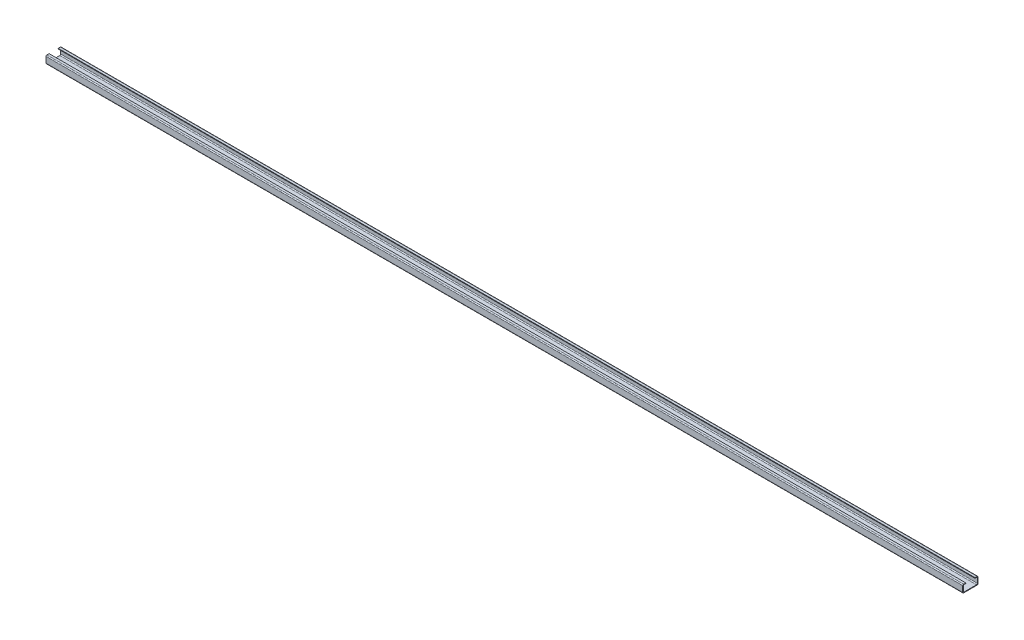
ISO-10303-21;
HEADER;
FILE_DESCRIPTION(('STEP AP214'),'2;1');
FILE_NAME('part.step','',(''),(''),'','','');
FILE_SCHEMA(('AUTOMOTIVE_DESIGN { 1 0 10303 214 1 1 1 1 }'));
ENDSEC;
DATA;
#1=APPLICATION_CONTEXT('core data for automotive mechanical design processes');
#2=APPLICATION_PROTOCOL_DEFINITION('international standard','automotive_design',2000,#1);
#3=PRODUCT_CONTEXT('',#1,'mechanical');
#4=PRODUCT('Part','Part','',(#3));
#5=PRODUCT_RELATED_PRODUCT_CATEGORY('part','',(#4));
#6=PRODUCT_DEFINITION_FORMATION('','',#4);
#7=PRODUCT_DEFINITION_CONTEXT('part definition',#1,'design');
#8=PRODUCT_DEFINITION('design','',#6,#7);
#9=PRODUCT_DEFINITION_SHAPE('','',#8);
#10=(LENGTH_UNIT() NAMED_UNIT(*) SI_UNIT(.MILLI.,.METRE.));
#11=(NAMED_UNIT(*) PLANE_ANGLE_UNIT() SI_UNIT($,.RADIAN.));
#12=(NAMED_UNIT(*) SI_UNIT($,.STERADIAN.) SOLID_ANGLE_UNIT());
#13=UNCERTAINTY_MEASURE_WITH_UNIT(LENGTH_MEASURE(1.E-05),#10,'distance_accuracy_value','');
#14=(GEOMETRIC_REPRESENTATION_CONTEXT(3) GLOBAL_UNCERTAINTY_ASSIGNED_CONTEXT((#13)) GLOBAL_UNIT_ASSIGNED_CONTEXT((#10,
#11,#12)) REPRESENTATION_CONTEXT('',''));
#15=CARTESIAN_POINT('',(0.,0.,0.));
#16=DIRECTION('',(0.,0.,1.));
#17=DIRECTION('',(1.,0.,0.));
#18=AXIS2_PLACEMENT_3D('',#15,#16,#17);
#19=CARTESIAN_POINT('',(6000.,25.,-50.));
#20=DIRECTION('',(0.,0.,1.));
#21=DIRECTION('',(0.,-1.,0.));
#22=AXIS2_PLACEMENT_3D('',#19,#20,#21);
#23=PLANE('',#22);
#24=DIRECTION('',(0.,1.,0.));
#25=VECTOR('',#24,1.);
#26=CARTESIAN_POINT('',(0.,25.,-50.));
#27=LINE('',#26,#25);
#28=CARTESIAN_POINT('',(0.,-19.,-50.));
#29=VERTEX_POINT('',#28);
#30=CARTESIAN_POINT('',(0.,19.,-50.));
#31=VERTEX_POINT('',#30);
#32=EDGE_CURVE('E224',#29,#31,#27,.T.);
#33=ORIENTED_EDGE('',*,*,#32,.T.);
#34=DIRECTION('',(-1.,0.,0.));
#35=VECTOR('',#34,1.);
#36=CARTESIAN_POINT('',(6000.,19.,-50.));
#37=LINE('',#36,#35);
#38=CARTESIAN_POINT('',(6000.,19.,-50.));
#39=VERTEX_POINT('',#38);
#40=EDGE_CURVE('E300',#31,#39,#37,.F.);
#41=ORIENTED_EDGE('',*,*,#40,.T.);
#42=DIRECTION('',(0.,1.,0.));
#43=VECTOR('',#42,1.);
#44=CARTESIAN_POINT('',(6000.,25.,-50.));
#45=LINE('',#44,#43);
#46=CARTESIAN_POINT('',(6000.,-19.,-50.));
#47=VERTEX_POINT('',#46);
#48=EDGE_CURVE('E184',#47,#39,#45,.T.);
#49=ORIENTED_EDGE('',*,*,#48,.F.);
#50=DIRECTION('',(-1.,0.,0.));
#51=VECTOR('',#50,1.);
#52=CARTESIAN_POINT('',(6000.,-19.,-50.));
#53=LINE('',#52,#51);
#54=EDGE_CURVE('E297',#47,#29,#53,.T.);
#55=ORIENTED_EDGE('',*,*,#54,.T.);
#56=EDGE_LOOP('',(#33,#41,#49,#55));
#57=FACE_BOUND('',#56,.T.);
#58=ADVANCED_FACE('F34',(#57),#23,.F.);
#59=CARTESIAN_POINT('',(6000.,25.,-30.));
#60=DIRECTION('',(0.,-1.,0.));
#61=DIRECTION('',(0.,0.,-1.));
#62=AXIS2_PLACEMENT_3D('',#59,#60,#61);
#63=PLANE('',#62);
#64=DIRECTION('',(0.,0.,1.));
#65=VECTOR('',#64,1.);
#66=CARTESIAN_POINT('',(6000.,25.,-30.));
#67=LINE('',#66,#65);
#68=CARTESIAN_POINT('',(6000.,25.,-44.));
#69=VERTEX_POINT('',#68);
#70=CARTESIAN_POINT('',(6000.,25.,-30.));
#71=VERTEX_POINT('',#70);
#72=EDGE_CURVE('E170',#69,#71,#67,.T.);
#73=ORIENTED_EDGE('',*,*,#72,.F.);
#74=DIRECTION('',(-1.,0.,0.));
#75=VECTOR('',#74,1.);
#76=CARTESIAN_POINT('',(6000.,25.,-44.));
#77=LINE('',#76,#75);
#78=CARTESIAN_POINT('',(0.,25.,-44.));
#79=VERTEX_POINT('',#78);
#80=EDGE_CURVE('E295',#69,#79,#77,.T.);
#81=ORIENTED_EDGE('',*,*,#80,.T.);
#82=DIRECTION('',(0.,0.,1.));
#83=VECTOR('',#82,1.);
#84=CARTESIAN_POINT('',(0.,25.,-30.));
#85=LINE('',#84,#83);
#86=CARTESIAN_POINT('',(0.,25.,-30.));
#87=VERTEX_POINT('',#86);
#88=EDGE_CURVE('E190',#79,#87,#85,.T.);
#89=ORIENTED_EDGE('',*,*,#88,.T.);
#90=DIRECTION('',(-1.,0.,0.));
#91=VECTOR('',#90,1.);
#92=CARTESIAN_POINT('',(6000.,25.,-30.));
#93=LINE('',#92,#91);
#94=EDGE_CURVE('E187',#71,#87,#93,.T.);
#95=ORIENTED_EDGE('',*,*,#94,.F.);
#96=EDGE_LOOP('',(#73,#81,#89,#95));
#97=FACE_BOUND('',#96,.T.);
#98=ADVANCED_FACE('F188',(#97),#63,.F.);
#99=CARTESIAN_POINT('',(6000.,25.,-30.));
#100=DIRECTION('',(0.,0.,-1.));
#101=DIRECTION('',(-1.,0.,0.));
#102=AXIS2_PLACEMENT_3D('',#99,#100,#101);
#103=PLANE('',#102);
#104=DIRECTION('',(0.,-1.,0.));
#105=VECTOR('',#104,1.);
#106=CARTESIAN_POINT('',(0.,25.,-30.));
#107=LINE('',#106,#105);
#108=CARTESIAN_POINT('',(0.,21.,-30.));
#109=VERTEX_POINT('',#108);
#110=EDGE_CURVE('E228',#87,#109,#107,.T.);
#111=ORIENTED_EDGE('',*,*,#110,.T.);
#112=DIRECTION('',(-1.,0.,0.));
#113=VECTOR('',#112,1.);
#114=CARTESIAN_POINT('',(6000.,21.,-30.));
#115=LINE('',#114,#113);
#116=CARTESIAN_POINT('',(6000.,21.,-30.));
#117=VERTEX_POINT('',#116);
#118=EDGE_CURVE('E194',#117,#109,#115,.T.);
#119=ORIENTED_EDGE('',*,*,#118,.F.);
#120=DIRECTION('',(0.,-1.,0.));
#121=VECTOR('',#120,1.);
#122=CARTESIAN_POINT('',(6000.,25.,-30.));
#123=LINE('',#122,#121);
#124=EDGE_CURVE('E176',#71,#117,#123,.T.);
#125=ORIENTED_EDGE('',*,*,#124,.F.);
#126=ORIENTED_EDGE('',*,*,#94,.T.);
#127=EDGE_LOOP('',(#111,#119,#125,#126));
#128=FACE_BOUND('',#127,.T.);
#129=ADVANCED_FACE('F196',(#128),#103,.F.);
#130=CARTESIAN_POINT('',(6000.,21.,-30.));
#131=DIRECTION('',(0.,1.,0.));
#132=DIRECTION('',(0.,0.,1.));
#133=AXIS2_PLACEMENT_3D('',#130,#131,#132);
#134=PLANE('',#133);
#135=DIRECTION('',(0.,0.,-1.));
#136=VECTOR('',#135,1.);
#137=CARTESIAN_POINT('',(0.,21.,-30.));
#138=LINE('',#137,#136);
#139=CARTESIAN_POINT('',(0.,21.,-40.));
#140=VERTEX_POINT('',#139);
#141=EDGE_CURVE('E230',#109,#140,#138,.T.);
#142=ORIENTED_EDGE('',*,*,#141,.T.);
#143=DIRECTION('',(-1.,0.,0.));
#144=VECTOR('',#143,1.);
#145=CARTESIAN_POINT('',(6000.,21.,-40.));
#146=LINE('',#145,#144);
#147=CARTESIAN_POINT('',(6000.,21.,-40.));
#148=VERTEX_POINT('',#147);
#149=EDGE_CURVE('E264',#140,#148,#146,.F.);
#150=ORIENTED_EDGE('',*,*,#149,.T.);
#151=DIRECTION('',(0.,0.,-1.));
#152=VECTOR('',#151,1.);
#153=CARTESIAN_POINT('',(6000.,21.,-30.));
#154=LINE('',#153,#152);
#155=EDGE_CURVE('E199',#117,#148,#154,.T.);
#156=ORIENTED_EDGE('',*,*,#155,.F.);
#157=ORIENTED_EDGE('',*,*,#118,.T.);
#158=EDGE_LOOP('',(#142,#150,#156,#157));
#159=FACE_BOUND('',#158,.T.);
#160=ADVANCED_FACE('F459',(#159),#134,.F.);
#161=CARTESIAN_POINT('',(6000.,21.,-46.));
#162=DIRECTION('',(0.,0.,-1.));
#163=DIRECTION('',(0.,1.,0.));
#164=AXIS2_PLACEMENT_3D('',#161,#162,#163);
#165=PLANE('',#164);
#166=DIRECTION('',(0.,-1.,0.));
#167=VECTOR('',#166,1.);
#168=CARTESIAN_POINT('',(6000.,21.,-46.));
#169=LINE('',#168,#167);
#170=CARTESIAN_POINT('',(6000.,15.,-46.));
#171=VERTEX_POINT('',#170);
#172=CARTESIAN_POINT('',(6000.,-15.,-46.));
#173=VERTEX_POINT('',#172);
#174=EDGE_CURVE('E201',#171,#173,#169,.T.);
#175=ORIENTED_EDGE('',*,*,#174,.F.);
#176=DIRECTION('',(-1.,0.,0.));
#177=VECTOR('',#176,1.);
#178=CARTESIAN_POINT('',(0.,15.,-46.));
#179=LINE('',#178,#177);
#180=CARTESIAN_POINT('',(0.,15.,-46.));
#181=VERTEX_POINT('',#180);
#182=EDGE_CURVE('E261',#171,#181,#179,.T.);
#183=ORIENTED_EDGE('',*,*,#182,.T.);
#184=DIRECTION('',(0.,-1.,0.));
#185=VECTOR('',#184,1.);
#186=CARTESIAN_POINT('',(0.,21.,-46.));
#187=LINE('',#186,#185);
#188=CARTESIAN_POINT('',(0.,-15.,-46.));
#189=VERTEX_POINT('',#188);
#190=EDGE_CURVE('E233',#181,#189,#187,.T.);
#191=ORIENTED_EDGE('',*,*,#190,.T.);
#192=DIRECTION('',(-1.,0.,0.));
#193=VECTOR('',#192,1.);
#194=CARTESIAN_POINT('',(6000.,-15.,-46.));
#195=LINE('',#194,#193);
#196=EDGE_CURVE('E193',#189,#173,#195,.F.);
#197=ORIENTED_EDGE('',*,*,#196,.T.);
#198=EDGE_LOOP('',(#175,#183,#191,#197));
#199=FACE_BOUND('',#198,.T.);
#200=ADVANCED_FACE('F454',(#199),#165,.F.);
#201=CARTESIAN_POINT('',(6000.,-21.,46.));
#202=DIRECTION('',(0.,-1.,0.));
#203=DIRECTION('',(0.,0.,-1.));
#204=AXIS2_PLACEMENT_3D('',#201,#202,#203);
#205=PLANE('',#204);
#206=DIRECTION('',(0.,0.,1.));
#207=VECTOR('',#206,1.);
#208=CARTESIAN_POINT('',(6000.,-21.,46.));
#209=LINE('',#208,#207);
#210=CARTESIAN_POINT('',(6000.,-21.,-40.));
#211=VERTEX_POINT('',#210);
#212=CARTESIAN_POINT('',(6000.,-21.,40.));
#213=VERTEX_POINT('',#212);
#214=EDGE_CURVE('E207',#211,#213,#209,.T.);
#215=ORIENTED_EDGE('',*,*,#214,.F.);
#216=DIRECTION('',(-1.,0.,0.));
#217=VECTOR('',#216,1.);
#218=CARTESIAN_POINT('',(0.,-21.,-40.));
#219=LINE('',#218,#217);
#220=CARTESIAN_POINT('',(0.,-21.,-40.));
#221=VERTEX_POINT('',#220);
#222=EDGE_CURVE('E308',#211,#221,#219,.T.);
#223=ORIENTED_EDGE('',*,*,#222,.T.);
#224=DIRECTION('',(0.,0.,1.));
#225=VECTOR('',#224,1.);
#226=CARTESIAN_POINT('',(0.,-21.,46.));
#227=LINE('',#226,#225);
#228=CARTESIAN_POINT('',(0.,-21.,40.));
#229=VERTEX_POINT('',#228);
#230=EDGE_CURVE('E236',#221,#229,#227,.T.);
#231=ORIENTED_EDGE('',*,*,#230,.T.);
#232=DIRECTION('',(-1.,0.,0.));
#233=VECTOR('',#232,1.);
#234=CARTESIAN_POINT('',(6000.,-21.,40.));
#235=LINE('',#234,#233);
#236=EDGE_CURVE('E306',#229,#213,#235,.F.);
#237=ORIENTED_EDGE('',*,*,#236,.T.);
#238=EDGE_LOOP('',(#215,#223,#231,#237));
#239=FACE_BOUND('',#238,.T.);
#240=ADVANCED_FACE('F332',(#239),#205,.F.);
#241=CARTESIAN_POINT('',(6000.,21.,46.));
#242=DIRECTION('',(0.,0.,1.));
#243=DIRECTION('',(0.,-1.,0.));
#244=AXIS2_PLACEMENT_3D('',#241,#242,#243);
#245=PLANE('',#244);
#246=DIRECTION('',(0.,1.,0.));
#247=VECTOR('',#246,1.);
#248=CARTESIAN_POINT('',(0.,21.,46.));
#249=LINE('',#248,#247);
#250=CARTESIAN_POINT('',(0.,-15.,46.));
#251=VERTEX_POINT('',#250);
#252=CARTESIAN_POINT('',(0.,15.,46.));
#253=VERTEX_POINT('',#252);
#254=EDGE_CURVE('E239',#251,#253,#249,.T.);
#255=ORIENTED_EDGE('',*,*,#254,.T.);
#256=DIRECTION('',(-1.,0.,0.));
#257=VECTOR('',#256,1.);
#258=CARTESIAN_POINT('',(6000.,15.,46.));
#259=LINE('',#258,#257);
#260=CARTESIAN_POINT('',(6000.,15.,46.));
#261=VERTEX_POINT('',#260);
#262=EDGE_CURVE('E272',#253,#261,#259,.F.);
#263=ORIENTED_EDGE('',*,*,#262,.T.);
#264=DIRECTION('',(0.,1.,0.));
#265=VECTOR('',#264,1.);
#266=CARTESIAN_POINT('',(6000.,21.,46.));
#267=LINE('',#266,#265);
#268=CARTESIAN_POINT('',(6000.,-15.,46.));
#269=VERTEX_POINT('',#268);
#270=EDGE_CURVE('E210',#269,#261,#267,.T.);
#271=ORIENTED_EDGE('',*,*,#270,.F.);
#272=DIRECTION('',(-1.,0.,0.));
#273=VECTOR('',#272,1.);
#274=CARTESIAN_POINT('',(0.,-15.,46.));
#275=LINE('',#274,#273);
#276=EDGE_CURVE('E269',#269,#251,#275,.T.);
#277=ORIENTED_EDGE('',*,*,#276,.T.);
#278=EDGE_LOOP('',(#255,#263,#271,#277));
#279=FACE_BOUND('',#278,.T.);
#280=ADVANCED_FACE('F339',(#279),#245,.F.);
#281=CARTESIAN_POINT('',(6000.,21.,46.));
#282=DIRECTION('',(0.,1.,0.));
#283=DIRECTION('',(0.,0.,1.));
#284=AXIS2_PLACEMENT_3D('',#281,#282,#283);
#285=PLANE('',#284);
#286=DIRECTION('',(0.,0.,-1.));
#287=VECTOR('',#286,1.);
#288=CARTESIAN_POINT('',(6000.,21.,46.));
#289=LINE('',#288,#287);
#290=CARTESIAN_POINT('',(6000.,21.,40.));
#291=VERTEX_POINT('',#290);
#292=CARTESIAN_POINT('',(6000.,21.,30.));
#293=VERTEX_POINT('',#292);
#294=EDGE_CURVE('E213',#291,#293,#289,.T.);
#295=ORIENTED_EDGE('',*,*,#294,.F.);
#296=DIRECTION('',(-1.,0.,0.));
#297=VECTOR('',#296,1.);
#298=CARTESIAN_POINT('',(0.,21.,40.));
#299=LINE('',#298,#297);
#300=CARTESIAN_POINT('',(0.,21.,40.));
#301=VERTEX_POINT('',#300);
#302=EDGE_CURVE('E266',#291,#301,#299,.T.);
#303=ORIENTED_EDGE('',*,*,#302,.T.);
#304=DIRECTION('',(0.,0.,-1.));
#305=VECTOR('',#304,1.);
#306=CARTESIAN_POINT('',(0.,21.,46.));
#307=LINE('',#306,#305);
#308=CARTESIAN_POINT('',(0.,21.,30.));
#309=VERTEX_POINT('',#308);
#310=EDGE_CURVE('E242',#301,#309,#307,.T.);
#311=ORIENTED_EDGE('',*,*,#310,.T.);
#312=DIRECTION('',(-1.,0.,0.));
#313=VECTOR('',#312,1.);
#314=CARTESIAN_POINT('',(6000.,21.,30.));
#315=LINE('',#314,#313);
#316=EDGE_CURVE('E256',#293,#309,#315,.T.);
#317=ORIENTED_EDGE('',*,*,#316,.F.);
#318=EDGE_LOOP('',(#295,#303,#311,#317));
#319=FACE_BOUND('',#318,.T.);
#320=ADVANCED_FACE('F347',(#319),#285,.F.);
#321=CARTESIAN_POINT('',(6000.,25.,30.));
#322=DIRECTION('',(0.,0.,1.));
#323=DIRECTION('',(1.,0.,0.));
#324=AXIS2_PLACEMENT_3D('',#321,#322,#323);
#325=PLANE('',#324);
#326=DIRECTION('',(0.,1.,0.));
#327=VECTOR('',#326,1.);
#328=CARTESIAN_POINT('',(0.,25.,30.));
#329=LINE('',#328,#327);
#330=CARTESIAN_POINT('',(0.,25.,30.));
#331=VERTEX_POINT('',#330);
#332=EDGE_CURVE('E244',#309,#331,#329,.T.);
#333=ORIENTED_EDGE('',*,*,#332,.T.);
#334=DIRECTION('',(-1.,0.,0.));
#335=VECTOR('',#334,1.);
#336=CARTESIAN_POINT('',(6000.,25.,30.));
#337=LINE('',#336,#335);
#338=CARTESIAN_POINT('',(6000.,25.,30.));
#339=VERTEX_POINT('',#338);
#340=EDGE_CURVE('E223',#339,#331,#337,.T.);
#341=ORIENTED_EDGE('',*,*,#340,.F.);
#342=DIRECTION('',(0.,1.,0.));
#343=VECTOR('',#342,1.);
#344=CARTESIAN_POINT('',(6000.,25.,30.));
#345=LINE('',#344,#343);
#346=EDGE_CURVE('E215',#293,#339,#345,.T.);
#347=ORIENTED_EDGE('',*,*,#346,.F.);
#348=ORIENTED_EDGE('',*,*,#316,.T.);
#349=EDGE_LOOP('',(#333,#341,#347,#348));
#350=FACE_BOUND('',#349,.T.);
#351=ADVANCED_FACE('F353',(#350),#325,.F.);
#352=CARTESIAN_POINT('',(6000.,25.,50.));
#353=DIRECTION('',(0.,-1.,0.));
#354=DIRECTION('',(0.,0.,-1.));
#355=AXIS2_PLACEMENT_3D('',#352,#353,#354);
#356=PLANE('',#355);
#357=DIRECTION('',(0.,0.,1.));
#358=VECTOR('',#357,1.);
#359=CARTESIAN_POINT('',(0.,25.,50.));
#360=LINE('',#359,#358);
#361=CARTESIAN_POINT('',(0.,25.,44.));
#362=VERTEX_POINT('',#361);
#363=EDGE_CURVE('E246',#331,#362,#360,.T.);
#364=ORIENTED_EDGE('',*,*,#363,.T.);
#365=DIRECTION('',(-1.,0.,0.));
#366=VECTOR('',#365,1.);
#367=CARTESIAN_POINT('',(6000.,25.,44.));
#368=LINE('',#367,#366);
#369=CARTESIAN_POINT('',(6000.,25.,44.));
#370=VERTEX_POINT('',#369);
#371=EDGE_CURVE('E287',#362,#370,#368,.F.);
#372=ORIENTED_EDGE('',*,*,#371,.T.);
#373=DIRECTION('',(0.,0.,1.));
#374=VECTOR('',#373,1.);
#375=CARTESIAN_POINT('',(6000.,25.,50.));
#376=LINE('',#375,#374);
#377=EDGE_CURVE('E217',#339,#370,#376,.T.);
#378=ORIENTED_EDGE('',*,*,#377,.F.);
#379=ORIENTED_EDGE('',*,*,#340,.T.);
#380=EDGE_LOOP('',(#364,#372,#378,#379));
#381=FACE_BOUND('',#380,.T.);
#382=ADVANCED_FACE('F476',(#381),#356,.F.);
#383=CARTESIAN_POINT('',(6000.,25.,50.));
#384=DIRECTION('',(0.,0.,-1.));
#385=DIRECTION('',(0.,1.,0.));
#386=AXIS2_PLACEMENT_3D('',#383,#384,#385);
#387=PLANE('',#386);
#388=DIRECTION('',(0.,-1.,0.));
#389=VECTOR('',#388,1.);
#390=CARTESIAN_POINT('',(6000.,25.,50.));
#391=LINE('',#390,#389);
#392=CARTESIAN_POINT('',(6000.,19.,50.));
#393=VERTEX_POINT('',#392);
#394=CARTESIAN_POINT('',(6000.,-19.,50.));
#395=VERTEX_POINT('',#394);
#396=EDGE_CURVE('E219',#393,#395,#391,.T.);
#397=ORIENTED_EDGE('',*,*,#396,.F.);
#398=DIRECTION('',(-1.,0.,0.));
#399=VECTOR('',#398,1.);
#400=CARTESIAN_POINT('',(6000.,19.,50.));
#401=LINE('',#400,#399);
#402=CARTESIAN_POINT('',(0.,19.,50.));
#403=VERTEX_POINT('',#402);
#404=EDGE_CURVE('E276',#393,#403,#401,.T.);
#405=ORIENTED_EDGE('',*,*,#404,.T.);
#406=DIRECTION('',(0.,-1.,0.));
#407=VECTOR('',#406,1.);
#408=CARTESIAN_POINT('',(0.,25.,50.));
#409=LINE('',#408,#407);
#410=CARTESIAN_POINT('',(0.,-19.,50.));
#411=VERTEX_POINT('',#410);
#412=EDGE_CURVE('E249',#403,#411,#409,.T.);
#413=ORIENTED_EDGE('',*,*,#412,.T.);
#414=DIRECTION('',(-1.,0.,0.));
#415=VECTOR('',#414,1.);
#416=CARTESIAN_POINT('',(6000.,-19.,50.));
#417=LINE('',#416,#415);
#418=EDGE_CURVE('E274',#411,#395,#417,.F.);
#419=ORIENTED_EDGE('',*,*,#418,.T.);
#420=EDGE_LOOP('',(#397,#405,#413,#419));
#421=FACE_BOUND('',#420,.T.);
#422=ADVANCED_FACE('F363',(#421),#387,.F.);
#423=CARTESIAN_POINT('',(6000.,-25.,50.));
#424=DIRECTION('',(0.,1.,0.));
#425=DIRECTION('',(0.,0.,1.));
#426=AXIS2_PLACEMENT_3D('',#423,#424,#425);
#427=PLANE('',#426);
#428=DIRECTION('',(0.,0.,-1.));
#429=VECTOR('',#428,1.);
#430=CARTESIAN_POINT('',(0.,-25.,50.));
#431=LINE('',#430,#429);
#432=CARTESIAN_POINT('',(0.,-25.,44.));
#433=VERTEX_POINT('',#432);
#434=CARTESIAN_POINT('',(0.,-25.,-44.));
#435=VERTEX_POINT('',#434);
#436=EDGE_CURVE('E252',#433,#435,#431,.T.);
#437=ORIENTED_EDGE('',*,*,#436,.T.);
#438=DIRECTION('',(-1.,0.,0.));
#439=VECTOR('',#438,1.);
#440=CARTESIAN_POINT('',(6000.,-25.,-44.));
#441=LINE('',#440,#439);
#442=CARTESIAN_POINT('',(6000.,-25.,-44.));
#443=VERTEX_POINT('',#442);
#444=EDGE_CURVE('E49',#435,#443,#441,.F.);
#445=ORIENTED_EDGE('',*,*,#444,.T.);
#446=DIRECTION('',(0.,0.,-1.));
#447=VECTOR('',#446,1.);
#448=CARTESIAN_POINT('',(6000.,-25.,50.));
#449=LINE('',#448,#447);
#450=CARTESIAN_POINT('',(6000.,-25.,44.));
#451=VERTEX_POINT('',#450);
#452=EDGE_CURVE('E221',#451,#443,#449,.T.);
#453=ORIENTED_EDGE('',*,*,#452,.F.);
#454=DIRECTION('',(-1.,0.,0.));
#455=VECTOR('',#454,1.);
#456=CARTESIAN_POINT('',(6000.,-25.,44.));
#457=LINE('',#456,#455);
#458=EDGE_CURVE('E302',#451,#433,#457,.T.);
#459=ORIENTED_EDGE('',*,*,#458,.T.);
#460=EDGE_LOOP('',(#437,#445,#453,#459));
#461=FACE_BOUND('',#460,.T.);
#462=ADVANCED_FACE('F369',(#461),#427,.F.);
#463=CARTESIAN_POINT('',(6000.,0.,0.));
#464=DIRECTION('',(1.,0.,0.));
#465=DIRECTION('',(0.,0.,-1.));
#466=AXIS2_PLACEMENT_3D('',#463,#464,#465);
#467=PLANE('',#466);
#468=ORIENTED_EDGE('',*,*,#377,.T.);
#469=CARTESIAN_POINT('',(6000.,19.,44.));
#470=DIRECTION('',(1.,0.,0.));
#471=DIRECTION('',(0.,0.,-1.));
#472=AXIS2_PLACEMENT_3D('',#469,#470,#471);
#473=CIRCLE('',#472,6.);
#474=EDGE_CURVE('E293',#370,#393,#473,.T.);
#475=ORIENTED_EDGE('',*,*,#474,.T.);
#476=ORIENTED_EDGE('',*,*,#396,.T.);
#477=CARTESIAN_POINT('',(6000.,-19.,44.));
#478=DIRECTION('',(1.,0.,0.));
#479=DIRECTION('',(0.,0.,-1.));
#480=AXIS2_PLACEMENT_3D('',#477,#478,#479);
#481=CIRCLE('',#480,6.);
#482=EDGE_CURVE('E56',#395,#451,#481,.T.);
#483=ORIENTED_EDGE('',*,*,#482,.T.);
#484=ORIENTED_EDGE('',*,*,#452,.T.);
#485=CARTESIAN_POINT('',(6000.,-19.,-44.));
#486=DIRECTION('',(1.,0.,0.));
#487=DIRECTION('',(0.,0.,-1.));
#488=AXIS2_PLACEMENT_3D('',#485,#486,#487);
#489=CIRCLE('',#488,6.);
#490=EDGE_CURVE('E290',#443,#47,#489,.T.);
#491=ORIENTED_EDGE('',*,*,#490,.T.);
#492=ORIENTED_EDGE('',*,*,#48,.T.);
#493=CARTESIAN_POINT('',(6000.,19.,-44.));
#494=DIRECTION('',(1.,0.,0.));
#495=DIRECTION('',(0.,0.,-1.));
#496=AXIS2_PLACEMENT_3D('',#493,#494,#495);
#497=CIRCLE('',#496,6.);
#498=EDGE_CURVE('E180',#39,#69,#497,.T.);
#499=ORIENTED_EDGE('',*,*,#498,.T.);
#500=ORIENTED_EDGE('',*,*,#72,.T.);
#501=ORIENTED_EDGE('',*,*,#124,.T.);
#502=ORIENTED_EDGE('',*,*,#155,.T.);
#503=CARTESIAN_POINT('',(6000.,15.,-40.));
#504=DIRECTION('',(1.,0.,0.));
#505=DIRECTION('',(0.,0.,-1.));
#506=AXIS2_PLACEMENT_3D('',#503,#504,#505);
#507=CIRCLE('',#506,6.);
#508=EDGE_CURVE('E313',#148,#171,#507,.F.);
#509=ORIENTED_EDGE('',*,*,#508,.T.);
#510=ORIENTED_EDGE('',*,*,#174,.T.);
#511=CARTESIAN_POINT('',(6000.,-15.,-40.));
#512=DIRECTION('',(1.,0.,0.));
#513=DIRECTION('',(0.,0.,-1.));
#514=AXIS2_PLACEMENT_3D('',#511,#512,#513);
#515=CIRCLE('',#514,6.);
#516=EDGE_CURVE('E321',#173,#211,#515,.F.);
#517=ORIENTED_EDGE('',*,*,#516,.T.);
#518=ORIENTED_EDGE('',*,*,#214,.T.);
#519=CARTESIAN_POINT('',(6000.,-15.,40.));
#520=DIRECTION('',(1.,0.,0.));
#521=DIRECTION('',(0.,0.,-1.));
#522=AXIS2_PLACEMENT_3D('',#519,#520,#521);
#523=CIRCLE('',#522,6.);
#524=EDGE_CURVE('E11',#213,#269,#523,.F.);
#525=ORIENTED_EDGE('',*,*,#524,.T.);
#526=ORIENTED_EDGE('',*,*,#270,.T.);
#527=CARTESIAN_POINT('',(6000.,15.,40.));
#528=DIRECTION('',(1.,0.,0.));
#529=DIRECTION('',(0.,0.,-1.));
#530=AXIS2_PLACEMENT_3D('',#527,#528,#529);
#531=CIRCLE('',#530,6.);
#532=EDGE_CURVE('E317',#261,#291,#531,.F.);
#533=ORIENTED_EDGE('',*,*,#532,.T.);
#534=ORIENTED_EDGE('',*,*,#294,.T.);
#535=ORIENTED_EDGE('',*,*,#346,.T.);
#536=EDGE_LOOP('',(#468,#475,#476,#483,#484,#491,#492,#499,#500,#501,#502,#509,#510,#517,#518,
#525,#526,#533,#534,#535));
#537=FACE_BOUND('',#536,.T.);
#538=ADVANCED_FACE('F173',(#537),#467,.T.);
#539=CARTESIAN_POINT('',(0.,0.,0.));
#540=DIRECTION('',(1.,0.,0.));
#541=DIRECTION('',(0.,0.,-1.));
#542=AXIS2_PLACEMENT_3D('',#539,#540,#541);
#543=PLANE('',#542);
#544=ORIENTED_EDGE('',*,*,#412,.F.);
#545=CARTESIAN_POINT('',(0.,19.,44.));
#546=DIRECTION('',(1.,0.,0.));
#547=DIRECTION('',(0.,0.,-1.));
#548=AXIS2_PLACEMENT_3D('',#545,#546,#547);
#549=CIRCLE('',#548,6.);
#550=EDGE_CURVE('E285',#403,#362,#549,.F.);
#551=ORIENTED_EDGE('',*,*,#550,.T.);
#552=ORIENTED_EDGE('',*,*,#363,.F.);
#553=ORIENTED_EDGE('',*,*,#332,.F.);
#554=ORIENTED_EDGE('',*,*,#310,.F.);
#555=CARTESIAN_POINT('',(0.,15.,40.));
#556=DIRECTION('',(1.,0.,0.));
#557=DIRECTION('',(0.,0.,-1.));
#558=AXIS2_PLACEMENT_3D('',#555,#556,#557);
#559=CIRCLE('',#558,6.);
#560=EDGE_CURVE('E315',#301,#253,#559,.T.);
#561=ORIENTED_EDGE('',*,*,#560,.T.);
#562=ORIENTED_EDGE('',*,*,#254,.F.);
#563=CARTESIAN_POINT('',(0.,-15.,40.));
#564=DIRECTION('',(1.,0.,0.));
#565=DIRECTION('',(0.,0.,-1.));
#566=AXIS2_PLACEMENT_3D('',#563,#564,#565);
#567=CIRCLE('',#566,6.);
#568=EDGE_CURVE('E42',#251,#229,#567,.T.);
#569=ORIENTED_EDGE('',*,*,#568,.T.);
#570=ORIENTED_EDGE('',*,*,#230,.F.);
#571=CARTESIAN_POINT('',(0.,-15.,-40.));
#572=DIRECTION('',(1.,0.,0.));
#573=DIRECTION('',(0.,0.,-1.));
#574=AXIS2_PLACEMENT_3D('',#571,#572,#573);
#575=CIRCLE('',#574,6.);
#576=EDGE_CURVE('E319',#221,#189,#575,.T.);
#577=ORIENTED_EDGE('',*,*,#576,.T.);
#578=ORIENTED_EDGE('',*,*,#190,.F.);
#579=CARTESIAN_POINT('',(0.,15.,-40.));
#580=DIRECTION('',(1.,0.,0.));
#581=DIRECTION('',(0.,0.,-1.));
#582=AXIS2_PLACEMENT_3D('',#579,#580,#581);
#583=CIRCLE('',#582,6.);
#584=EDGE_CURVE('E311',#181,#140,#583,.T.);
#585=ORIENTED_EDGE('',*,*,#584,.T.);
#586=ORIENTED_EDGE('',*,*,#141,.F.);
#587=ORIENTED_EDGE('',*,*,#110,.F.);
#588=ORIENTED_EDGE('',*,*,#88,.F.);
#589=CARTESIAN_POINT('',(0.,19.,-44.));
#590=DIRECTION('',(1.,0.,0.));
#591=DIRECTION('',(0.,0.,-1.));
#592=AXIS2_PLACEMENT_3D('',#589,#590,#591);
#593=CIRCLE('',#592,6.);
#594=EDGE_CURVE('E283',#79,#31,#593,.F.);
#595=ORIENTED_EDGE('',*,*,#594,.T.);
#596=ORIENTED_EDGE('',*,*,#32,.F.);
#597=CARTESIAN_POINT('',(0.,-19.,-44.));
#598=DIRECTION('',(1.,0.,0.));
#599=DIRECTION('',(0.,0.,-1.));
#600=AXIS2_PLACEMENT_3D('',#597,#598,#599);
#601=CIRCLE('',#600,6.);
#602=EDGE_CURVE('E281',#29,#435,#601,.F.);
#603=ORIENTED_EDGE('',*,*,#602,.T.);
#604=ORIENTED_EDGE('',*,*,#436,.F.);
#605=CARTESIAN_POINT('',(0.,-19.,44.));
#606=DIRECTION('',(1.,0.,0.));
#607=DIRECTION('',(0.,0.,-1.));
#608=AXIS2_PLACEMENT_3D('',#605,#606,#607);
#609=CIRCLE('',#608,6.);
#610=EDGE_CURVE('E279',#433,#411,#609,.F.);
#611=ORIENTED_EDGE('',*,*,#610,.T.);
#612=EDGE_LOOP('',(#544,#551,#552,#553,#554,#561,#562,#569,#570,#577,#578,#585,#586,#587,#588,
#595,#596,#603,#604,#611));
#613=FACE_BOUND('',#612,.T.);
#614=ADVANCED_FACE('F326',(#613),#543,.F.);
#615=CARTESIAN_POINT('',(6000.,15.,-40.));
#616=DIRECTION('',(1.,0.,0.));
#617=DIRECTION('',(0.,0.,-1.));
#618=AXIS2_PLACEMENT_3D('',#615,#616,#617);
#619=CYLINDRICAL_SURFACE('',#618,6.);
#620=ORIENTED_EDGE('',*,*,#508,.F.);
#621=ORIENTED_EDGE('',*,*,#149,.F.);
#622=ORIENTED_EDGE('',*,*,#584,.F.);
#623=ORIENTED_EDGE('',*,*,#182,.F.);
#624=EDGE_LOOP('',(#620,#621,#622,#623));
#625=FACE_BOUND('',#624,.T.);
#626=ADVANCED_FACE('F397',(#625),#619,.F.);
#627=CARTESIAN_POINT('',(6000.,15.,40.));
#628=DIRECTION('',(1.,0.,0.));
#629=DIRECTION('',(0.,0.,-1.));
#630=AXIS2_PLACEMENT_3D('',#627,#628,#629);
#631=CYLINDRICAL_SURFACE('',#630,6.);
#632=ORIENTED_EDGE('',*,*,#532,.F.);
#633=ORIENTED_EDGE('',*,*,#262,.F.);
#634=ORIENTED_EDGE('',*,*,#560,.F.);
#635=ORIENTED_EDGE('',*,*,#302,.F.);
#636=EDGE_LOOP('',(#632,#633,#634,#635));
#637=FACE_BOUND('',#636,.T.);
#638=ADVANCED_FACE('F342',(#637),#631,.F.);
#639=CARTESIAN_POINT('',(6000.,19.,44.));
#640=DIRECTION('',(-1.,0.,0.));
#641=DIRECTION('',(0.,0.,1.));
#642=AXIS2_PLACEMENT_3D('',#639,#640,#641);
#643=CYLINDRICAL_SURFACE('',#642,6.);
#644=ORIENTED_EDGE('',*,*,#474,.F.);
#645=ORIENTED_EDGE('',*,*,#371,.F.);
#646=ORIENTED_EDGE('',*,*,#550,.F.);
#647=ORIENTED_EDGE('',*,*,#404,.F.);
#648=EDGE_LOOP('',(#644,#645,#646,#647));
#649=FACE_BOUND('',#648,.T.);
#650=ADVANCED_FACE('F361',(#649),#643,.T.);
#651=CARTESIAN_POINT('',(6000.,19.,-44.));
#652=DIRECTION('',(-1.,0.,0.));
#653=DIRECTION('',(0.,0.,1.));
#654=AXIS2_PLACEMENT_3D('',#651,#652,#653);
#655=CYLINDRICAL_SURFACE('',#654,6.);
#656=ORIENTED_EDGE('',*,*,#498,.F.);
#657=ORIENTED_EDGE('',*,*,#40,.F.);
#658=ORIENTED_EDGE('',*,*,#594,.F.);
#659=ORIENTED_EDGE('',*,*,#80,.F.);
#660=EDGE_LOOP('',(#656,#657,#658,#659));
#661=FACE_BOUND('',#660,.T.);
#662=ADVANCED_FACE('F379',(#661),#655,.T.);
#663=CARTESIAN_POINT('',(6000.,-19.,-44.));
#664=DIRECTION('',(-1.,0.,0.));
#665=DIRECTION('',(0.,0.,1.));
#666=AXIS2_PLACEMENT_3D('',#663,#664,#665);
#667=CYLINDRICAL_SURFACE('',#666,6.);
#668=ORIENTED_EDGE('',*,*,#490,.F.);
#669=ORIENTED_EDGE('',*,*,#444,.F.);
#670=ORIENTED_EDGE('',*,*,#602,.F.);
#671=ORIENTED_EDGE('',*,*,#54,.F.);
#672=EDGE_LOOP('',(#668,#669,#670,#671));
#673=FACE_BOUND('',#672,.T.);
#674=ADVANCED_FACE('F374',(#673),#667,.T.);
#675=CARTESIAN_POINT('',(6000.,-15.,-40.));
#676=DIRECTION('',(1.,0.,0.));
#677=DIRECTION('',(0.,0.,-1.));
#678=AXIS2_PLACEMENT_3D('',#675,#676,#677);
#679=CYLINDRICAL_SURFACE('',#678,6.);
#680=ORIENTED_EDGE('',*,*,#516,.F.);
#681=ORIENTED_EDGE('',*,*,#196,.F.);
#682=ORIENTED_EDGE('',*,*,#576,.F.);
#683=ORIENTED_EDGE('',*,*,#222,.F.);
#684=EDGE_LOOP('',(#680,#681,#682,#683));
#685=FACE_BOUND('',#684,.T.);
#686=ADVANCED_FACE('F386',(#685),#679,.F.);
#687=CARTESIAN_POINT('',(6000.,-15.,40.));
#688=DIRECTION('',(1.,0.,0.));
#689=DIRECTION('',(0.,0.,-1.));
#690=AXIS2_PLACEMENT_3D('',#687,#688,#689);
#691=CYLINDRICAL_SURFACE('',#690,6.);
#692=ORIENTED_EDGE('',*,*,#524,.F.);
#693=ORIENTED_EDGE('',*,*,#236,.F.);
#694=ORIENTED_EDGE('',*,*,#568,.F.);
#695=ORIENTED_EDGE('',*,*,#276,.F.);
#696=EDGE_LOOP('',(#692,#693,#694,#695));
#697=FACE_BOUND('',#696,.T.);
#698=ADVANCED_FACE('F335',(#697),#691,.F.);
#699=CARTESIAN_POINT('',(6000.,-19.,44.));
#700=DIRECTION('',(-1.,0.,0.));
#701=DIRECTION('',(0.,0.,1.));
#702=AXIS2_PLACEMENT_3D('',#699,#700,#701);
#703=CYLINDRICAL_SURFACE('',#702,6.);
#704=ORIENTED_EDGE('',*,*,#482,.F.);
#705=ORIENTED_EDGE('',*,*,#418,.F.);
#706=ORIENTED_EDGE('',*,*,#610,.F.);
#707=ORIENTED_EDGE('',*,*,#458,.F.);
#708=EDGE_LOOP('',(#704,#705,#706,#707));
#709=FACE_BOUND('',#708,.T.);
#710=ADVANCED_FACE('F36',(#709),#703,.T.);
#711=CLOSED_SHELL('',(#58,#98,#129,#160,#200,#240,#280,#320,#351,#382,#422,#462,#538,#614,#626,
#638,#650,#662,#674,#686,#698,#710));
#712=MANIFOLD_SOLID_BREP('B2',#711);
#713=ADVANCED_BREP_SHAPE_REPRESENTATION('',(#18,#712),#14);
#714=SHAPE_DEFINITION_REPRESENTATION(#9,#713);
ENDSEC;
END-ISO-10303-21;
